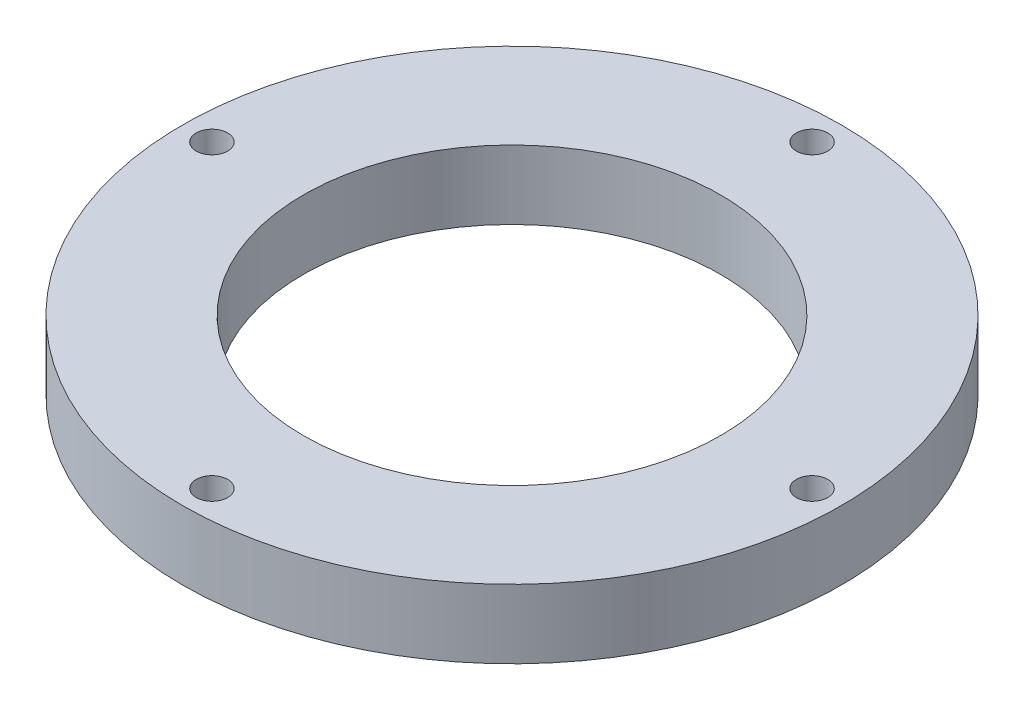
ISO-10303-21;
HEADER;
FILE_DESCRIPTION(('STEP AP214'),'2;1');
FILE_NAME('part.step','',(''),(''),'','','');
FILE_SCHEMA(('AUTOMOTIVE_DESIGN { 1 0 10303 214 1 1 1 1 }'));
ENDSEC;
DATA;
#1=APPLICATION_CONTEXT('core data for automotive mechanical design processes');
#2=APPLICATION_PROTOCOL_DEFINITION('international standard','automotive_design',2000,#1);
#3=PRODUCT_CONTEXT('',#1,'mechanical');
#4=PRODUCT('Part','Part','',(#3));
#5=PRODUCT_RELATED_PRODUCT_CATEGORY('part','',(#4));
#6=PRODUCT_DEFINITION_FORMATION('','',#4);
#7=PRODUCT_DEFINITION_CONTEXT('part definition',#1,'design');
#8=PRODUCT_DEFINITION('design','',#6,#7);
#9=PRODUCT_DEFINITION_SHAPE('','',#8);
#10=(LENGTH_UNIT() NAMED_UNIT(*) SI_UNIT(.MILLI.,.METRE.));
#11=(NAMED_UNIT(*) PLANE_ANGLE_UNIT() SI_UNIT($,.RADIAN.));
#12=(NAMED_UNIT(*) SI_UNIT($,.STERADIAN.) SOLID_ANGLE_UNIT());
#13=UNCERTAINTY_MEASURE_WITH_UNIT(LENGTH_MEASURE(1.E-05),#10,'distance_accuracy_value','');
#14=(GEOMETRIC_REPRESENTATION_CONTEXT(3) GLOBAL_UNCERTAINTY_ASSIGNED_CONTEXT((#13)) GLOBAL_UNIT_ASSIGNED_CONTEXT((#10,
#11,#12)) REPRESENTATION_CONTEXT('',''));
#15=CARTESIAN_POINT('',(0.,0.,0.));
#16=DIRECTION('',(0.,0.,1.));
#17=DIRECTION('',(1.,0.,0.));
#18=AXIS2_PLACEMENT_3D('',#15,#16,#17);
#19=CARTESIAN_POINT('',(0.,7.,0.));
#20=DIRECTION('',(0.,1.,0.));
#21=DIRECTION('',(0.,0.,1.));
#22=AXIS2_PLACEMENT_3D('',#19,#20,#21);
#23=PLANE('',#22);
#24=CARTESIAN_POINT('',(0.,7.,-30.5));
#25=DIRECTION('',(0.,1.,0.));
#26=DIRECTION('',(0.,0.,1.));
#27=AXIS2_PLACEMENT_3D('',#24,#25,#26);
#28=CIRCLE('',#27,1.6);
#29=CARTESIAN_POINT('',(0.,7.,-28.9));
#30=VERTEX_POINT('',#29);
#31=EDGE_CURVE('E88',#30,#30,#28,.T.);
#32=ORIENTED_EDGE('',*,*,#31,.F.);
#33=EDGE_LOOP('',(#32));
#34=FACE_BOUND('',#33,.T.);
#35=CARTESIAN_POINT('',(30.5000000000009,7.,-8.61259378521223E-13));
#36=DIRECTION('',(0.,1.,0.));
#37=DIRECTION('',(0.,0.,1.));
#38=AXIS2_PLACEMENT_3D('',#35,#36,#37);
#39=CIRCLE('',#38,1.60000000000067);
#40=CARTESIAN_POINT('',(30.5000000000009,7.,1.59999999999981));
#41=VERTEX_POINT('',#40);
#42=EDGE_CURVE('E84',#41,#41,#39,.T.);
#43=ORIENTED_EDGE('',*,*,#42,.F.);
#44=EDGE_LOOP('',(#43));
#45=FACE_BOUND('',#44,.T.);
#46=CARTESIAN_POINT('',(1.72251875704245E-12,7.,30.5));
#47=DIRECTION('',(0.,1.,0.));
#48=DIRECTION('',(0.,0.,1.));
#49=AXIS2_PLACEMENT_3D('',#46,#47,#48);
#50=CIRCLE('',#49,1.60000000000185);
#51=CARTESIAN_POINT('',(1.72251875704245E-12,7.,32.1000000000018));
#52=VERTEX_POINT('',#51);
#53=EDGE_CURVE('E76',#52,#52,#50,.T.);
#54=ORIENTED_EDGE('',*,*,#53,.F.);
#55=EDGE_LOOP('',(#54));
#56=FACE_BOUND('',#55,.T.);
#57=CARTESIAN_POINT('',(-30.4999999999991,7.,8.64994551258623E-13));
#58=DIRECTION('',(0.,1.,0.));
#59=DIRECTION('',(0.,0.,1.));
#60=AXIS2_PLACEMENT_3D('',#57,#58,#59);
#61=CIRCLE('',#60,1.60000000000138);
#62=CARTESIAN_POINT('',(-30.4999999999991,7.,1.60000000000225));
#63=VERTEX_POINT('',#62);
#64=EDGE_CURVE('E68',#63,#63,#61,.T.);
#65=ORIENTED_EDGE('',*,*,#64,.F.);
#66=EDGE_LOOP('',(#65));
#67=FACE_BOUND('',#66,.T.);
#68=CARTESIAN_POINT('',(0.,7.,0.));
#69=DIRECTION('',(0.,1.,0.));
#70=DIRECTION('',(0.,0.,1.));
#71=AXIS2_PLACEMENT_3D('',#68,#69,#70);
#72=CIRCLE('',#71,33.5);
#73=CARTESIAN_POINT('',(0.,7.,33.5));
#74=VERTEX_POINT('',#73);
#75=EDGE_CURVE('E10',#74,#74,#72,.T.);
#76=ORIENTED_EDGE('',*,*,#75,.T.);
#77=EDGE_LOOP('',(#76));
#78=FACE_BOUND('',#77,.T.);
#79=CARTESIAN_POINT('',(0.,7.,0.));
#80=DIRECTION('',(0.,1.,0.));
#81=DIRECTION('',(0.,0.,1.));
#82=AXIS2_PLACEMENT_3D('',#79,#80,#81);
#83=CIRCLE('',#82,21.2);
#84=CARTESIAN_POINT('',(0.,7.,21.2));
#85=VERTEX_POINT('',#84);
#86=EDGE_CURVE('E54',#85,#85,#83,.T.);
#87=ORIENTED_EDGE('',*,*,#86,.F.);
#88=EDGE_LOOP('',(#87));
#89=FACE_BOUND('',#88,.T.);
#90=ADVANCED_FACE('F41',(#34,#45,#56,#67,#78,#89),#23,.T.);
#91=CARTESIAN_POINT('',(0.,0.,0.));
#92=DIRECTION('',(0.,1.,0.));
#93=DIRECTION('',(0.,0.,1.));
#94=AXIS2_PLACEMENT_3D('',#91,#92,#93);
#95=PLANE('',#94);
#96=CARTESIAN_POINT('',(0.,0.,-30.5));
#97=DIRECTION('',(0.,1.,0.));
#98=DIRECTION('',(0.,0.,1.));
#99=AXIS2_PLACEMENT_3D('',#96,#97,#98);
#100=CIRCLE('',#99,1.6);
#101=CARTESIAN_POINT('',(0.,0.,-28.9));
#102=VERTEX_POINT('',#101);
#103=EDGE_CURVE('E60',#102,#102,#100,.T.);
#104=ORIENTED_EDGE('',*,*,#103,.T.);
#105=EDGE_LOOP('',(#104));
#106=FACE_BOUND('',#105,.T.);
#107=CARTESIAN_POINT('',(30.5000000000009,0.,-8.61259378521223E-13));
#108=DIRECTION('',(0.,1.,0.));
#109=DIRECTION('',(0.,0.,1.));
#110=AXIS2_PLACEMENT_3D('',#107,#108,#109);
#111=CIRCLE('',#110,1.60000000000067);
#112=CARTESIAN_POINT('',(30.5000000000009,0.,1.59999999999981));
#113=VERTEX_POINT('',#112);
#114=EDGE_CURVE('E80',#113,#113,#111,.T.);
#115=ORIENTED_EDGE('',*,*,#114,.T.);
#116=EDGE_LOOP('',(#115));
#117=FACE_BOUND('',#116,.T.);
#118=CARTESIAN_POINT('',(1.72251875704245E-12,0.,30.5));
#119=DIRECTION('',(0.,1.,0.));
#120=DIRECTION('',(0.,0.,1.));
#121=AXIS2_PLACEMENT_3D('',#118,#119,#120);
#122=CIRCLE('',#121,1.60000000000185);
#123=CARTESIAN_POINT('',(1.72251875704245E-12,0.,32.1000000000018));
#124=VERTEX_POINT('',#123);
#125=EDGE_CURVE('E72',#124,#124,#122,.T.);
#126=ORIENTED_EDGE('',*,*,#125,.T.);
#127=EDGE_LOOP('',(#126));
#128=FACE_BOUND('',#127,.T.);
#129=CARTESIAN_POINT('',(-30.4999999999991,0.,8.64994551258623E-13));
#130=DIRECTION('',(0.,1.,0.));
#131=DIRECTION('',(0.,0.,1.));
#132=AXIS2_PLACEMENT_3D('',#129,#130,#131);
#133=CIRCLE('',#132,1.60000000000138);
#134=CARTESIAN_POINT('',(-30.4999999999991,0.,1.60000000000225));
#135=VERTEX_POINT('',#134);
#136=EDGE_CURVE('E64',#135,#135,#133,.T.);
#137=ORIENTED_EDGE('',*,*,#136,.T.);
#138=EDGE_LOOP('',(#137));
#139=FACE_BOUND('',#138,.T.);
#140=CARTESIAN_POINT('',(0.,0.,0.));
#141=DIRECTION('',(0.,1.,0.));
#142=DIRECTION('',(0.,0.,1.));
#143=AXIS2_PLACEMENT_3D('',#140,#141,#142);
#144=CIRCLE('',#143,33.5);
#145=CARTESIAN_POINT('',(0.,0.,33.5));
#146=VERTEX_POINT('',#145);
#147=EDGE_CURVE('E45',#146,#146,#144,.T.);
#148=ORIENTED_EDGE('',*,*,#147,.F.);
#149=EDGE_LOOP('',(#148));
#150=FACE_BOUND('',#149,.T.);
#151=CARTESIAN_POINT('',(0.,0.,0.));
#152=DIRECTION('',(0.,1.,0.));
#153=DIRECTION('',(0.,0.,1.));
#154=AXIS2_PLACEMENT_3D('',#151,#152,#153);
#155=CIRCLE('',#154,21.2);
#156=CARTESIAN_POINT('',(0.,0.,21.2));
#157=VERTEX_POINT('',#156);
#158=EDGE_CURVE('E56',#157,#157,#155,.T.);
#159=ORIENTED_EDGE('',*,*,#158,.T.);
#160=EDGE_LOOP('',(#159));
#161=FACE_BOUND('',#160,.T.);
#162=ADVANCED_FACE('F96',(#106,#117,#128,#139,#150,#161),#95,.F.);
#163=CARTESIAN_POINT('',(0.,7.,0.));
#164=DIRECTION('',(0.,-1.,0.));
#165=DIRECTION('',(0.,0.,-1.));
#166=AXIS2_PLACEMENT_3D('',#163,#164,#165);
#167=CYLINDRICAL_SURFACE('',#166,33.5);
#168=ORIENTED_EDGE('',*,*,#75,.F.);
#169=EDGE_LOOP('',(#168));
#170=FACE_BOUND('',#169,.T.);
#171=ORIENTED_EDGE('',*,*,#147,.T.);
#172=EDGE_LOOP('',(#171));
#173=FACE_BOUND('',#172,.T.);
#174=ADVANCED_FACE('F43',(#170,#173),#167,.T.);
#175=CARTESIAN_POINT('',(0.,7.,0.));
#176=DIRECTION('',(0.,-1.,0.));
#177=DIRECTION('',(0.,0.,-1.));
#178=AXIS2_PLACEMENT_3D('',#175,#176,#177);
#179=CYLINDRICAL_SURFACE('',#178,21.2);
#180=ORIENTED_EDGE('',*,*,#86,.T.);
#181=EDGE_LOOP('',(#180));
#182=FACE_BOUND('',#181,.T.);
#183=ORIENTED_EDGE('',*,*,#158,.F.);
#184=EDGE_LOOP('',(#183));
#185=FACE_BOUND('',#184,.T.);
#186=ADVANCED_FACE('F117',(#182,#185),#179,.F.);
#187=CARTESIAN_POINT('',(-30.4999999999991,0.,8.64994551258623E-13));
#188=DIRECTION('',(0.,1.,0.));
#189=DIRECTION('',(0.,0.,1.));
#190=AXIS2_PLACEMENT_3D('',#187,#188,#189);
#191=CYLINDRICAL_SURFACE('',#190,1.60000000000138);
#192=ORIENTED_EDGE('',*,*,#136,.F.);
#193=EDGE_LOOP('',(#192));
#194=FACE_BOUND('',#193,.T.);
#195=ORIENTED_EDGE('',*,*,#64,.T.);
#196=EDGE_LOOP('',(#195));
#197=FACE_BOUND('',#196,.T.);
#198=ADVANCED_FACE('F120',(#194,#197),#191,.F.);
#199=CARTESIAN_POINT('',(1.72251875704245E-12,0.,30.5));
#200=DIRECTION('',(0.,1.,0.));
#201=DIRECTION('',(0.,0.,1.));
#202=AXIS2_PLACEMENT_3D('',#199,#200,#201);
#203=CYLINDRICAL_SURFACE('',#202,1.60000000000185);
#204=ORIENTED_EDGE('',*,*,#125,.F.);
#205=EDGE_LOOP('',(#204));
#206=FACE_BOUND('',#205,.T.);
#207=ORIENTED_EDGE('',*,*,#53,.T.);
#208=EDGE_LOOP('',(#207));
#209=FACE_BOUND('',#208,.T.);
#210=ADVANCED_FACE('F132',(#206,#209),#203,.F.);
#211=CARTESIAN_POINT('',(30.5000000000009,0.,-8.61259378521223E-13));
#212=DIRECTION('',(0.,1.,0.));
#213=DIRECTION('',(0.,0.,1.));
#214=AXIS2_PLACEMENT_3D('',#211,#212,#213);
#215=CYLINDRICAL_SURFACE('',#214,1.60000000000067);
#216=ORIENTED_EDGE('',*,*,#114,.F.);
#217=EDGE_LOOP('',(#216));
#218=FACE_BOUND('',#217,.T.);
#219=ORIENTED_EDGE('',*,*,#42,.T.);
#220=EDGE_LOOP('',(#219));
#221=FACE_BOUND('',#220,.T.);
#222=ADVANCED_FACE('F102',(#218,#221),#215,.F.);
#223=CARTESIAN_POINT('',(0.,0.,-30.5));
#224=DIRECTION('',(0.,1.,0.));
#225=DIRECTION('',(0.,0.,1.));
#226=AXIS2_PLACEMENT_3D('',#223,#224,#225);
#227=CYLINDRICAL_SURFACE('',#226,1.6);
#228=ORIENTED_EDGE('',*,*,#103,.F.);
#229=EDGE_LOOP('',(#228));
#230=FACE_BOUND('',#229,.T.);
#231=ORIENTED_EDGE('',*,*,#31,.T.);
#232=EDGE_LOOP('',(#231));
#233=FACE_BOUND('',#232,.T.);
#234=ADVANCED_FACE('F99',(#230,#233),#227,.F.);
#235=CLOSED_SHELL('',(#90,#162,#174,#186,#198,#210,#222,#234));
#236=MANIFOLD_SOLID_BREP('B2',#235);
#237=ADVANCED_BREP_SHAPE_REPRESENTATION('',(#18,#236),#14);
#238=SHAPE_DEFINITION_REPRESENTATION(#9,#237);
ENDSEC;
END-ISO-10303-21;
